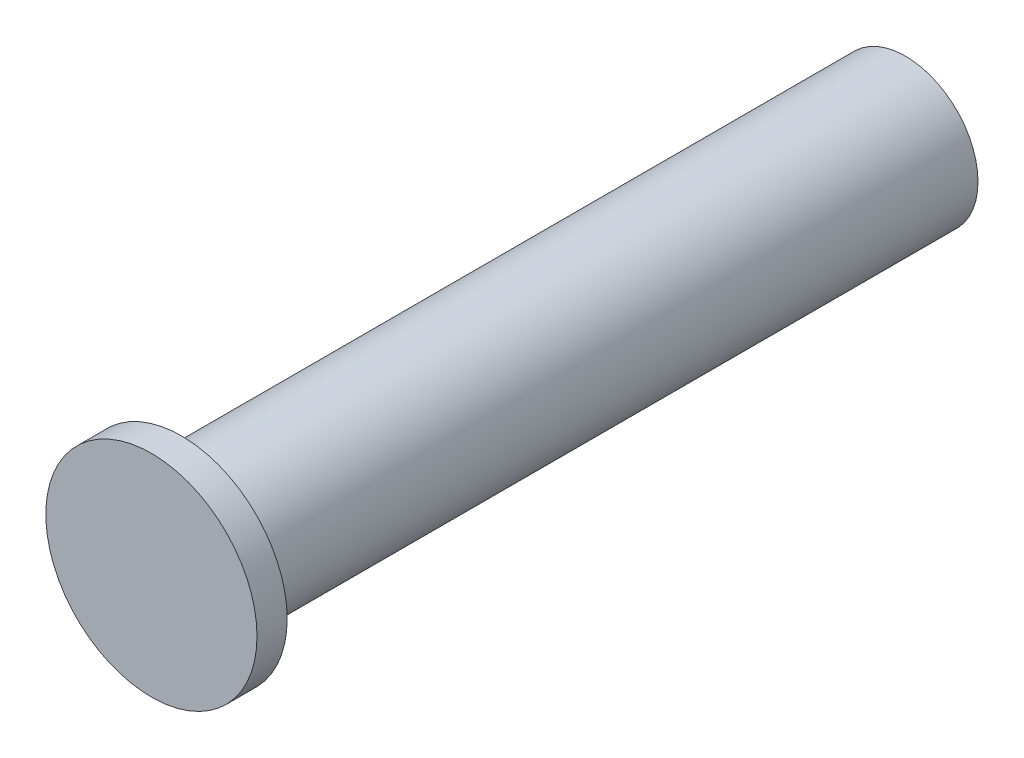
ISO-10303-21;
HEADER;
FILE_DESCRIPTION(('STEP AP214'),'2;1');
FILE_NAME('part.step','',(''),(''),'','','');
FILE_SCHEMA(('AUTOMOTIVE_DESIGN { 1 0 10303 214 1 1 1 1 }'));
ENDSEC;
DATA;
#1=APPLICATION_CONTEXT('core data for automotive mechanical design processes');
#2=APPLICATION_PROTOCOL_DEFINITION('international standard','automotive_design',2000,#1);
#3=PRODUCT_CONTEXT('',#1,'mechanical');
#4=PRODUCT('Part','Part','',(#3));
#5=PRODUCT_RELATED_PRODUCT_CATEGORY('part','',(#4));
#6=PRODUCT_DEFINITION_FORMATION('','',#4);
#7=PRODUCT_DEFINITION_CONTEXT('part definition',#1,'design');
#8=PRODUCT_DEFINITION('design','',#6,#7);
#9=PRODUCT_DEFINITION_SHAPE('','',#8);
#10=(LENGTH_UNIT() NAMED_UNIT(*) SI_UNIT(.MILLI.,.METRE.));
#11=(NAMED_UNIT(*) PLANE_ANGLE_UNIT() SI_UNIT($,.RADIAN.));
#12=(NAMED_UNIT(*) SI_UNIT($,.STERADIAN.) SOLID_ANGLE_UNIT());
#13=UNCERTAINTY_MEASURE_WITH_UNIT(LENGTH_MEASURE(1.E-05),#10,'distance_accuracy_value','');
#14=(GEOMETRIC_REPRESENTATION_CONTEXT(3) GLOBAL_UNCERTAINTY_ASSIGNED_CONTEXT((#13)) GLOBAL_UNIT_ASSIGNED_CONTEXT((#10,
#11,#12)) REPRESENTATION_CONTEXT('',''));
#15=CARTESIAN_POINT('',(0.,0.,0.));
#16=DIRECTION('',(0.,0.,1.));
#17=DIRECTION('',(1.,0.,0.));
#18=AXIS2_PLACEMENT_3D('',#15,#16,#17);
#19=CARTESIAN_POINT('',(0.,0.,48.));
#20=DIRECTION('',(0.,0.,-1.));
#21=DIRECTION('',(-1.,0.,0.));
#22=AXIS2_PLACEMENT_3D('',#19,#20,#21);
#23=CYLINDRICAL_SURFACE('',#22,4.8);
#24=CARTESIAN_POINT('',(0.,0.,48.));
#25=DIRECTION('',(0.,0.,1.));
#26=DIRECTION('',(1.,0.,0.));
#27=AXIS2_PLACEMENT_3D('',#24,#25,#26);
#28=CIRCLE('',#27,4.8);
#29=CARTESIAN_POINT('',(4.8,0.,48.));
#30=VERTEX_POINT('',#29);
#31=EDGE_CURVE('E10',#30,#30,#28,.T.);
#32=ORIENTED_EDGE('',*,*,#31,.F.);
#33=EDGE_LOOP('',(#32));
#34=FACE_BOUND('',#33,.T.);
#35=CARTESIAN_POINT('',(0.,0.,0.));
#36=DIRECTION('',(0.,0.,1.));
#37=DIRECTION('',(1.,0.,0.));
#38=AXIS2_PLACEMENT_3D('',#35,#36,#37);
#39=CIRCLE('',#38,4.8);
#40=CARTESIAN_POINT('',(4.8,0.,0.));
#41=VERTEX_POINT('',#40);
#42=EDGE_CURVE('E46',#41,#41,#39,.T.);
#43=ORIENTED_EDGE('',*,*,#42,.T.);
#44=EDGE_LOOP('',(#43));
#45=FACE_BOUND('',#44,.T.);
#46=ADVANCED_FACE('F43',(#34,#45),#23,.T.);
#47=CARTESIAN_POINT('',(0.,0.,0.));
#48=DIRECTION('',(0.,0.,1.));
#49=DIRECTION('',(1.,0.,0.));
#50=AXIS2_PLACEMENT_3D('',#47,#48,#49);
#51=PLANE('',#50);
#52=ORIENTED_EDGE('',*,*,#42,.F.);
#53=EDGE_LOOP('',(#52));
#54=FACE_BOUND('',#53,.T.);
#55=ADVANCED_FACE('F70',(#54),#51,.F.);
#56=CARTESIAN_POINT('',(0.,0.,50.));
#57=DIRECTION('',(0.,0.,-1.));
#58=DIRECTION('',(-1.,0.,0.));
#59=AXIS2_PLACEMENT_3D('',#56,#57,#58);
#60=CYLINDRICAL_SURFACE('',#59,7.);
#61=CARTESIAN_POINT('',(0.,0.,50.));
#62=DIRECTION('',(0.,0.,1.));
#63=DIRECTION('',(1.,0.,0.));
#64=AXIS2_PLACEMENT_3D('',#61,#62,#63);
#65=CIRCLE('',#64,7.);
#66=CARTESIAN_POINT('',(7.,0.,50.));
#67=VERTEX_POINT('',#66);
#68=EDGE_CURVE('E55',#67,#67,#65,.T.);
#69=ORIENTED_EDGE('',*,*,#68,.F.);
#70=EDGE_LOOP('',(#69));
#71=FACE_BOUND('',#70,.T.);
#72=CARTESIAN_POINT('',(0.,0.,48.));
#73=DIRECTION('',(0.,0.,1.));
#74=DIRECTION('',(1.,0.,0.));
#75=AXIS2_PLACEMENT_3D('',#72,#73,#74);
#76=CIRCLE('',#75,7.);
#77=CARTESIAN_POINT('',(7.,0.,48.));
#78=VERTEX_POINT('',#77);
#79=EDGE_CURVE('E57',#78,#78,#76,.T.);
#80=ORIENTED_EDGE('',*,*,#79,.T.);
#81=EDGE_LOOP('',(#80));
#82=FACE_BOUND('',#81,.T.);
#83=ADVANCED_FACE('F67',(#71,#82),#60,.T.);
#84=CARTESIAN_POINT('',(0.,0.,50.));
#85=DIRECTION('',(0.,0.,1.));
#86=DIRECTION('',(1.,0.,0.));
#87=AXIS2_PLACEMENT_3D('',#84,#85,#86);
#88=PLANE('',#87);
#89=ORIENTED_EDGE('',*,*,#68,.T.);
#90=EDGE_LOOP('',(#89));
#91=FACE_BOUND('',#90,.T.);
#92=ADVANCED_FACE('F65',(#91),#88,.T.);
#93=CARTESIAN_POINT('',(0.,0.,48.));
#94=DIRECTION('',(0.,0.,1.));
#95=DIRECTION('',(1.,0.,0.));
#96=AXIS2_PLACEMENT_3D('',#93,#94,#95);
#97=PLANE('',#96);
#98=ORIENTED_EDGE('',*,*,#31,.T.);
#99=EDGE_LOOP('',(#98));
#100=FACE_BOUND('',#99,.T.);
#101=ORIENTED_EDGE('',*,*,#79,.F.);
#102=EDGE_LOOP('',(#101));
#103=FACE_BOUND('',#102,.T.);
#104=ADVANCED_FACE('F74',(#100,#103),#97,.F.);
#105=CLOSED_SHELL('',(#46,#55,#83,#92,#104));
#106=MANIFOLD_SOLID_BREP('B2',#105);
#107=ADVANCED_BREP_SHAPE_REPRESENTATION('',(#18,#106),#14);
#108=SHAPE_DEFINITION_REPRESENTATION(#9,#107);
ENDSEC;
END-ISO-10303-21;
